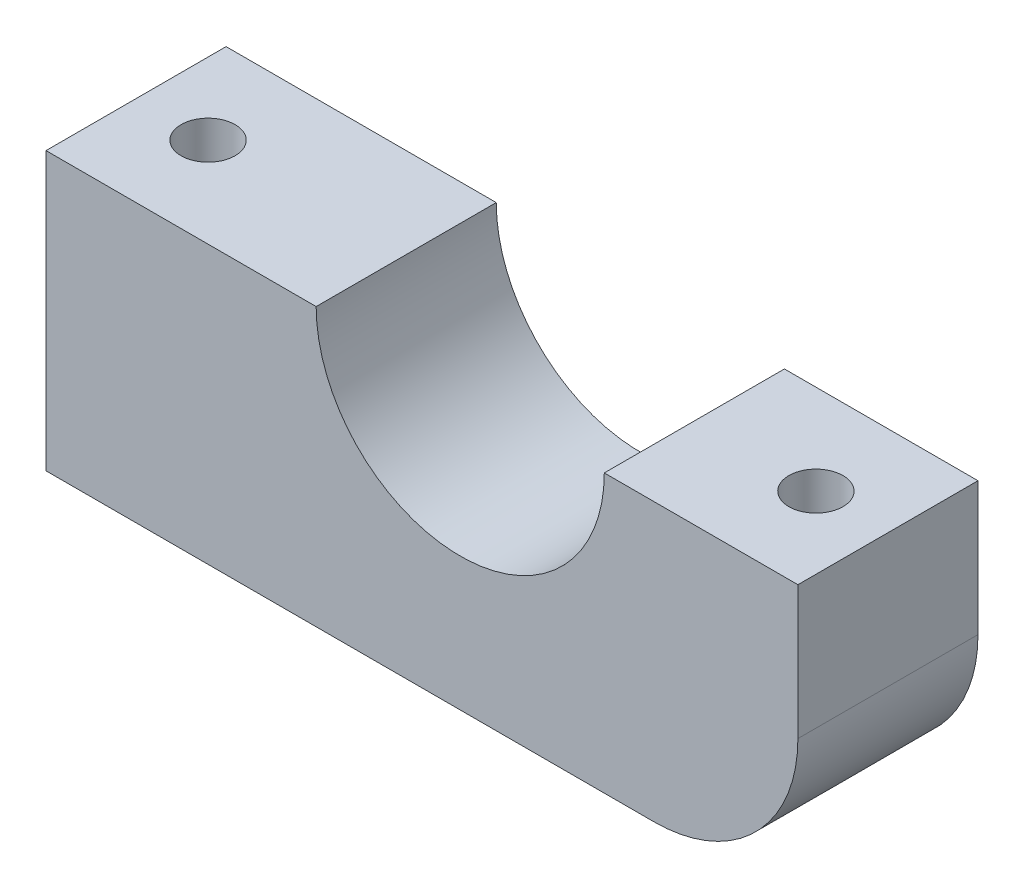
ISO-10303-21;
HEADER;
FILE_DESCRIPTION(('STEP AP214'),'2;1');
FILE_NAME('part.step','',(''),(''),'','','');
FILE_SCHEMA(('AUTOMOTIVE_DESIGN { 1 0 10303 214 1 1 1 1 }'));
ENDSEC;
DATA;
#1=APPLICATION_CONTEXT('core data for automotive mechanical design processes');
#2=APPLICATION_PROTOCOL_DEFINITION('international standard','automotive_design',2000,#1);
#3=PRODUCT_CONTEXT('',#1,'mechanical');
#4=PRODUCT('Part','Part','',(#3));
#5=PRODUCT_RELATED_PRODUCT_CATEGORY('part','',(#4));
#6=PRODUCT_DEFINITION_FORMATION('','',#4);
#7=PRODUCT_DEFINITION_CONTEXT('part definition',#1,'design');
#8=PRODUCT_DEFINITION('design','',#6,#7);
#9=PRODUCT_DEFINITION_SHAPE('','',#8);
#10=(LENGTH_UNIT() NAMED_UNIT(*) SI_UNIT(.MILLI.,.METRE.));
#11=(NAMED_UNIT(*) PLANE_ANGLE_UNIT() SI_UNIT($,.RADIAN.));
#12=(NAMED_UNIT(*) SI_UNIT($,.STERADIAN.) SOLID_ANGLE_UNIT());
#13=UNCERTAINTY_MEASURE_WITH_UNIT(LENGTH_MEASURE(1.E-05),#10,'distance_accuracy_value','');
#14=(GEOMETRIC_REPRESENTATION_CONTEXT(3) GLOBAL_UNCERTAINTY_ASSIGNED_CONTEXT((#13)) GLOBAL_UNIT_ASSIGNED_CONTEXT((#10,
#11,#12)) REPRESENTATION_CONTEXT('',''));
#15=CARTESIAN_POINT('',(0.,0.,0.));
#16=DIRECTION('',(0.,0.,1.));
#17=DIRECTION('',(1.,0.,0.));
#18=AXIS2_PLACEMENT_3D('',#15,#16,#17);
#19=CARTESIAN_POINT('',(0.,-7.40000000000001,10.));
#20=DIRECTION('',(-1.,0.,0.));
#21=DIRECTION('',(0.,0.,1.));
#22=AXIS2_PLACEMENT_3D('',#19,#20,#21);
#23=PLANE('',#22);
#24=DIRECTION('',(0.,1.,0.));
#25=VECTOR('',#24,1.);
#26=CARTESIAN_POINT('',(0.,-7.40000000000001,0.));
#27=LINE('',#26,#25);
#28=CARTESIAN_POINT('',(0.,-7.40000000000001,0.));
#29=VERTEX_POINT('',#28);
#30=CARTESIAN_POINT('',(0.,0.,0.));
#31=VERTEX_POINT('',#30);
#32=EDGE_CURVE('E129',#29,#31,#27,.T.);
#33=ORIENTED_EDGE('',*,*,#32,.T.);
#34=DIRECTION('',(0.,0.,-1.));
#35=VECTOR('',#34,1.);
#36=CARTESIAN_POINT('',(0.,0.,10.));
#37=LINE('',#36,#35);
#38=CARTESIAN_POINT('',(0.,0.,10.));
#39=VERTEX_POINT('',#38);
#40=EDGE_CURVE('E11',#39,#31,#37,.T.);
#41=ORIENTED_EDGE('',*,*,#40,.F.);
#42=DIRECTION('',(0.,1.,0.));
#43=VECTOR('',#42,1.);
#44=CARTESIAN_POINT('',(0.,-7.40000000000001,10.));
#45=LINE('',#44,#43);
#46=CARTESIAN_POINT('',(0.,-7.40000000000001,10.));
#47=VERTEX_POINT('',#46);
#48=EDGE_CURVE('E141',#47,#39,#45,.T.);
#49=ORIENTED_EDGE('',*,*,#48,.F.);
#50=DIRECTION('',(0.,0.,-1.));
#51=VECTOR('',#50,1.);
#52=CARTESIAN_POINT('',(0.,-7.40000000000001,10.));
#53=LINE('',#52,#51);
#54=EDGE_CURVE('E125',#47,#29,#53,.T.);
#55=ORIENTED_EDGE('',*,*,#54,.T.);
#56=EDGE_LOOP('',(#33,#41,#49,#55));
#57=FACE_BOUND('',#56,.T.);
#58=ADVANCED_FACE('F33',(#57),#23,.F.);
#59=CARTESIAN_POINT('',(0.,0.,10.));
#60=DIRECTION('',(0.,-1.,0.));
#61=DIRECTION('',(1.,0.,0.));
#62=AXIS2_PLACEMENT_3D('',#59,#60,#61);
#63=PLANE('',#62);
#64=CARTESIAN_POINT('',(-4.,0.,5.));
#65=DIRECTION('',(0.,-1.,0.));
#66=DIRECTION('',(0.,0.,-1.));
#67=AXIS2_PLACEMENT_3D('',#64,#65,#66);
#68=CIRCLE('',#67,1.5);
#69=CARTESIAN_POINT('',(-4.,0.,3.5));
#70=VERTEX_POINT('',#69);
#71=EDGE_CURVE('E165',#70,#70,#68,.T.);
#72=ORIENTED_EDGE('',*,*,#71,.T.);
#73=EDGE_LOOP('',(#72));
#74=FACE_BOUND('',#73,.T.);
#75=DIRECTION('',(-1.,0.,0.));
#76=VECTOR('',#75,1.);
#77=CARTESIAN_POINT('',(0.,0.,0.));
#78=LINE('',#77,#76);
#79=CARTESIAN_POINT('',(-10.75,0.,0.));
#80=VERTEX_POINT('',#79);
#81=EDGE_CURVE('E132',#31,#80,#78,.T.);
#82=ORIENTED_EDGE('',*,*,#81,.T.);
#83=DIRECTION('',(0.,0.,-1.));
#84=VECTOR('',#83,1.);
#85=CARTESIAN_POINT('',(-10.75,0.,10.));
#86=LINE('',#85,#84);
#87=CARTESIAN_POINT('',(-10.75,0.,10.));
#88=VERTEX_POINT('',#87);
#89=EDGE_CURVE('E47',#88,#80,#86,.T.);
#90=ORIENTED_EDGE('',*,*,#89,.F.);
#91=DIRECTION('',(-1.,0.,0.));
#92=VECTOR('',#91,1.);
#93=CARTESIAN_POINT('',(0.,0.,10.));
#94=LINE('',#93,#92);
#95=EDGE_CURVE('E95',#39,#88,#94,.T.);
#96=ORIENTED_EDGE('',*,*,#95,.F.);
#97=ORIENTED_EDGE('',*,*,#40,.T.);
#98=EDGE_LOOP('',(#82,#90,#96,#97));
#99=FACE_BOUND('',#98,.T.);
#100=ADVANCED_FACE('F195',(#74,#99),#63,.F.);
#101=CARTESIAN_POINT('',(-18.75,0.,10.));
#102=DIRECTION('',(0.,0.,-1.));
#103=DIRECTION('',(-1.,0.,0.));
#104=AXIS2_PLACEMENT_3D('',#101,#102,#103);
#105=CYLINDRICAL_SURFACE('',#104,8.);
#106=CARTESIAN_POINT('',(-18.75,0.,0.));
#107=DIRECTION('',(0.,0.,-1.));
#108=DIRECTION('',(-1.,0.,0.));
#109=AXIS2_PLACEMENT_3D('',#106,#107,#108);
#110=CIRCLE('',#109,8.);
#111=CARTESIAN_POINT('',(-26.75,0.,0.));
#112=VERTEX_POINT('',#111);
#113=EDGE_CURVE('E134',#80,#112,#110,.T.);
#114=ORIENTED_EDGE('',*,*,#113,.T.);
#115=DIRECTION('',(0.,0.,-1.));
#116=VECTOR('',#115,1.);
#117=CARTESIAN_POINT('',(-26.75,0.,10.));
#118=LINE('',#117,#116);
#119=CARTESIAN_POINT('',(-26.75,0.,10.));
#120=VERTEX_POINT('',#119);
#121=EDGE_CURVE('E145',#120,#112,#118,.T.);
#122=ORIENTED_EDGE('',*,*,#121,.F.);
#123=CARTESIAN_POINT('',(-18.75,0.,10.));
#124=DIRECTION('',(0.,0.,-1.));
#125=DIRECTION('',(-1.,0.,0.));
#126=AXIS2_PLACEMENT_3D('',#123,#124,#125);
#127=CIRCLE('',#126,8.);
#128=EDGE_CURVE('E154',#88,#120,#127,.T.);
#129=ORIENTED_EDGE('',*,*,#128,.F.);
#130=ORIENTED_EDGE('',*,*,#89,.T.);
#131=EDGE_LOOP('',(#114,#122,#129,#130));
#132=FACE_BOUND('',#131,.T.);
#133=ADVANCED_FACE('F152',(#132),#105,.F.);
#134=CARTESIAN_POINT('',(-26.75,0.,10.));
#135=DIRECTION('',(0.,-1.,0.));
#136=DIRECTION('',(1.,0.,0.));
#137=AXIS2_PLACEMENT_3D('',#134,#135,#136);
#138=PLANE('',#137);
#139=CARTESIAN_POINT('',(-37.75,0.,5.));
#140=DIRECTION('',(0.,-1.,0.));
#141=DIRECTION('',(0.,0.,-1.));
#142=AXIS2_PLACEMENT_3D('',#139,#140,#141);
#143=CIRCLE('',#142,1.5);
#144=CARTESIAN_POINT('',(-37.75,0.,3.5));
#145=VERTEX_POINT('',#144);
#146=EDGE_CURVE('E171',#145,#145,#143,.T.);
#147=ORIENTED_EDGE('',*,*,#146,.T.);
#148=EDGE_LOOP('',(#147));
#149=FACE_BOUND('',#148,.T.);
#150=DIRECTION('',(-1.,0.,0.));
#151=VECTOR('',#150,1.);
#152=CARTESIAN_POINT('',(-26.75,0.,0.));
#153=LINE('',#152,#151);
#154=CARTESIAN_POINT('',(-41.75,0.,0.));
#155=VERTEX_POINT('',#154);
#156=EDGE_CURVE('E136',#112,#155,#153,.T.);
#157=ORIENTED_EDGE('',*,*,#156,.T.);
#158=DIRECTION('',(0.,0.,-1.));
#159=VECTOR('',#158,1.);
#160=CARTESIAN_POINT('',(-41.75,0.,10.));
#161=LINE('',#160,#159);
#162=CARTESIAN_POINT('',(-41.75,0.,10.));
#163=VERTEX_POINT('',#162);
#164=EDGE_CURVE('E120',#163,#155,#161,.T.);
#165=ORIENTED_EDGE('',*,*,#164,.F.);
#166=DIRECTION('',(-1.,0.,0.));
#167=VECTOR('',#166,1.);
#168=CARTESIAN_POINT('',(-26.75,0.,10.));
#169=LINE('',#168,#167);
#170=EDGE_CURVE('E111',#120,#163,#169,.T.);
#171=ORIENTED_EDGE('',*,*,#170,.F.);
#172=ORIENTED_EDGE('',*,*,#121,.T.);
#173=EDGE_LOOP('',(#157,#165,#171,#172));
#174=FACE_BOUND('',#173,.T.);
#175=ADVANCED_FACE('F160',(#149,#174),#138,.F.);
#176=CARTESIAN_POINT('',(-41.75,0.,10.));
#177=DIRECTION('',(1.,0.,0.));
#178=DIRECTION('',(0.,0.,-1.));
#179=AXIS2_PLACEMENT_3D('',#176,#177,#178);
#180=PLANE('',#179);
#181=DIRECTION('',(0.,-1.,0.));
#182=VECTOR('',#181,1.);
#183=CARTESIAN_POINT('',(-41.75,0.,0.));
#184=LINE('',#183,#182);
#185=CARTESIAN_POINT('',(-41.75,-15.4,0.));
#186=VERTEX_POINT('',#185);
#187=EDGE_CURVE('E119',#155,#186,#184,.T.);
#188=ORIENTED_EDGE('',*,*,#187,.T.);
#189=DIRECTION('',(0.,0.,-1.));
#190=VECTOR('',#189,1.);
#191=CARTESIAN_POINT('',(-41.75,-15.4,10.));
#192=LINE('',#191,#190);
#193=CARTESIAN_POINT('',(-41.75,-15.4,10.));
#194=VERTEX_POINT('',#193);
#195=EDGE_CURVE('E116',#194,#186,#192,.T.);
#196=ORIENTED_EDGE('',*,*,#195,.F.);
#197=DIRECTION('',(0.,-1.,0.));
#198=VECTOR('',#197,1.);
#199=CARTESIAN_POINT('',(-41.75,0.,10.));
#200=LINE('',#199,#198);
#201=EDGE_CURVE('E105',#163,#194,#200,.T.);
#202=ORIENTED_EDGE('',*,*,#201,.F.);
#203=ORIENTED_EDGE('',*,*,#164,.T.);
#204=EDGE_LOOP('',(#188,#196,#202,#203));
#205=FACE_BOUND('',#204,.T.);
#206=ADVANCED_FACE('F117',(#205),#180,.F.);
#207=CARTESIAN_POINT('',(-41.75,-15.4,10.));
#208=DIRECTION('',(0.,1.,0.));
#209=DIRECTION('',(0.,0.,1.));
#210=AXIS2_PLACEMENT_3D('',#207,#208,#209);
#211=PLANE('',#210);
#212=CARTESIAN_POINT('',(-37.75,-15.4,5.));
#213=DIRECTION('',(0.,-1.,0.));
#214=DIRECTION('',(0.,0.,-1.));
#215=AXIS2_PLACEMENT_3D('',#212,#213,#214);
#216=CIRCLE('',#215,1.5);
#217=CARTESIAN_POINT('',(-37.75,-15.4,3.5));
#218=VERTEX_POINT('',#217);
#219=EDGE_CURVE('E168',#218,#218,#216,.T.);
#220=ORIENTED_EDGE('',*,*,#219,.F.);
#221=EDGE_LOOP('',(#220));
#222=FACE_BOUND('',#221,.T.);
#223=DIRECTION('',(1.,0.,0.));
#224=VECTOR('',#223,1.);
#225=CARTESIAN_POINT('',(-41.75,-15.4,0.));
#226=LINE('',#225,#224);
#227=CARTESIAN_POINT('',(-7.99999999999999,-15.4,0.));
#228=VERTEX_POINT('',#227);
#229=EDGE_CURVE('E81',#186,#228,#226,.T.);
#230=ORIENTED_EDGE('',*,*,#229,.T.);
#231=DIRECTION('',(0.,0.,-1.));
#232=VECTOR('',#231,1.);
#233=CARTESIAN_POINT('',(-7.99999999999999,-15.4,10.));
#234=LINE('',#233,#232);
#235=CARTESIAN_POINT('',(-7.99999999999999,-15.4,10.));
#236=VERTEX_POINT('',#235);
#237=EDGE_CURVE('E121',#236,#228,#234,.T.);
#238=ORIENTED_EDGE('',*,*,#237,.F.);
#239=DIRECTION('',(1.,0.,0.));
#240=VECTOR('',#239,1.);
#241=CARTESIAN_POINT('',(-41.75,-15.4,10.));
#242=LINE('',#241,#240);
#243=EDGE_CURVE('E109',#194,#236,#242,.T.);
#244=ORIENTED_EDGE('',*,*,#243,.F.);
#245=ORIENTED_EDGE('',*,*,#195,.T.);
#246=EDGE_LOOP('',(#230,#238,#244,#245));
#247=FACE_BOUND('',#246,.T.);
#248=ADVANCED_FACE('F123',(#222,#247),#211,.F.);
#249=CARTESIAN_POINT('',(-7.99999999999999,-7.40000000000001,10.));
#250=DIRECTION('',(0.,0.,-1.));
#251=DIRECTION('',(-1.,0.,0.));
#252=AXIS2_PLACEMENT_3D('',#249,#250,#251);
#253=CYLINDRICAL_SURFACE('',#252,7.99999999999999);
#254=CARTESIAN_POINT('',(-4.,-14.3282032302755,3.5));
#255=CARTESIAN_POINT('',(-4.08680670402507,-14.3783233106405,3.49999989272947));
#256=CARTESIAN_POINT('',(-4.17455896428764,-14.4267933749712,3.50753757262054));
#257=CARTESIAN_POINT('',(-4.34960501359529,-14.5192971023157,3.53860865036146));
#258=CARTESIAN_POINT('',(-4.43689899932406,-14.563332846585,3.56213450357897));
#259=CARTESIAN_POINT('',(-4.60852404850147,-14.6461730341864,3.62591050608382));
#260=CARTESIAN_POINT('',(-4.69283593978991,-14.6849470305588,3.66625291410436));
#261=CARTESIAN_POINT('',(-4.85434507326227,-14.7561296767181,3.76348816226957));
#262=CARTESIAN_POINT('',(-4.93154569067832,-14.7885413546081,3.82037309696233));
#263=CARTESIAN_POINT('',(-5.06777038535734,-14.8435807905122,3.94292678121187));
#264=CARTESIAN_POINT('',(-5.12784138072442,-14.8668643697944,4.00713880268065));
#265=CARTESIAN_POINT('',(-5.23646678252848,-14.9077467282545,4.14622996176544));
#266=CARTESIAN_POINT('',(-5.28502676327006,-14.9253482605113,4.22110390802047));
#267=CARTESIAN_POINT('',(-5.36518085166446,-14.953767480843,4.37303483019136));
#268=CARTESIAN_POINT('',(-5.3977951778787,-14.9650039204844,4.4494772384912));
#269=CARTESIAN_POINT('',(-5.45003379735012,-14.9827726075745,4.60719348170719));
#270=CARTESIAN_POINT('',(-5.46966101263259,-14.9893059132305,4.68846622533782));
#271=CARTESIAN_POINT('',(-5.49473118069431,-14.997617875685,4.85068013457382));
#272=CARTESIAN_POINT('',(-5.50061518571535,-14.9995444244252,4.93154592688109));
#273=CARTESIAN_POINT('',(-5.49928312154889,-14.9991062747023,5.0931552140267));
#274=CARTESIAN_POINT('',(-5.49206810402221,-14.9967419207363,5.17389871816211));
#275=CARTESIAN_POINT('',(-5.46491933608708,-14.9877246289447,5.33228869197247));
#276=CARTESIAN_POINT('',(-5.4450893041174,-14.9811066590564,5.40995498114689));
#277=CARTESIAN_POINT('',(-5.39353922571779,-14.9635374291953,5.56070874518144));
#278=CARTESIAN_POINT('',(-5.36181943753214,-14.9525862633387,5.63379631945055));
#279=CARTESIAN_POINT('',(-5.28738157568995,-14.9261719804428,5.77394453884486));
#280=CARTESIAN_POINT('',(-5.24458465452082,-14.9106764063163,5.84095712390285));
#281=CARTESIAN_POINT('',(-5.14968128626279,-14.8751751099636,5.96666302567109));
#282=CARTESIAN_POINT('',(-5.09757425165783,-14.8551691030851,6.0253558169401));
#283=CARTESIAN_POINT('',(-4.984316172656,-14.8100917892311,6.13467590398808));
#284=CARTESIAN_POINT('',(-4.92295144777113,-14.7848935007073,6.18502893442128));
#285=CARTESIAN_POINT('',(-4.79447106226799,-14.7300383743339,6.27473933207851));
#286=CARTESIAN_POINT('',(-4.72735417657801,-14.7003805856984,6.31409434934844));
#287=CARTESIAN_POINT('',(-4.58515650482647,-14.6350075387128,6.38355993965957));
#288=CARTESIAN_POINT('',(-4.50984016060917,-14.5990294827053,6.41293866355232));
#289=CARTESIAN_POINT('',(-4.35736816786328,-14.523096161896,6.45898573008983));
#290=CARTESIAN_POINT('',(-4.28021177030279,-14.4831392556548,6.47564880224134));
#291=CARTESIAN_POINT('',(-4.11797621332024,-14.3956580876246,6.49781913335193));
#292=CARTESIAN_POINT('',(-4.03290667113345,-14.3477789092468,6.50198765147735));
#293=CARTESIAN_POINT('',(-3.86495791225382,-14.2491555946787,6.49627323860909));
#294=CARTESIAN_POINT('',(-3.7820794991175,-14.1984104282628,6.48638522349753));
#295=CARTESIAN_POINT('',(-3.60991356089666,-14.0887078183162,6.45137509107178));
#296=CARTESIAN_POINT('',(-3.52112901002705,-14.0295196003175,6.42449509586432));
#297=CARTESIAN_POINT('',(-3.35007660654954,-13.9106901838141,6.35504142529164));
#298=CARTESIAN_POINT('',(-3.26781835787889,-13.851048454259,6.31244512424913));
#299=CARTESIAN_POINT('',(-3.10520918157032,-13.7286801445301,6.2080747225438));
#300=CARTESIAN_POINT('',(-3.02556520504035,-13.6661005276662,6.14501648483447));
#301=CARTESIAN_POINT('',(-2.8786425938171,-13.5465937813204,6.00152845609086));
#302=CARTESIAN_POINT('',(-2.81133733175009,-13.4896546046943,5.92113690730113));
#303=CARTESIAN_POINT('',(-2.71403853973603,-13.4050964720593,5.77524208358828));
#304=CARTESIAN_POINT('',(-2.67931735166543,-13.3742824588362,5.71472711097872));
#305=CARTESIAN_POINT('',(-2.61786597555449,-13.3189809824994,5.58711085645145));
#306=CARTESIAN_POINT('',(-2.59112232931899,-13.2944828739772,5.52002092357982));
#307=CARTESIAN_POINT('',(-2.55053671491501,-13.256961707142,5.39102889731088));
#308=CARTESIAN_POINT('',(-2.53534833467103,-13.2427577097022,5.32989870217814));
#309=CARTESIAN_POINT('',(-2.51272321000711,-13.2215152272371,5.20500166814518));
#310=CARTESIAN_POINT('',(-2.50528161719868,-13.2144722604883,5.14123650437675));
#311=CARTESIAN_POINT('',(-2.49867079437491,-13.2082183681492,5.0127078745318));
#312=CARTESIAN_POINT('',(-2.49952437293753,-13.209029037062,4.94794214509067));
#313=CARTESIAN_POINT('',(-2.50949295835815,-13.2184513423829,4.81963006565738));
#314=CARTESIAN_POINT('',(-2.51861020052893,-13.2270650895155,4.75608405034634));
#315=CARTESIAN_POINT('',(-2.5439820084511,-13.2508247817027,4.63429266913699));
#316=CARTESIAN_POINT('',(-2.5599599197862,-13.2657171588353,4.57593816667355));
#317=CARTESIAN_POINT('',(-2.59813348742472,-13.3008907394917,4.46303793972127));
#318=CARTESIAN_POINT('',(-2.6203322791913,-13.3211746602083,4.40849415328319));
#319=CARTESIAN_POINT('',(-2.68130646263219,-13.3761058166637,4.28019862087498));
#320=CARTESIAN_POINT('',(-2.72304491344685,-13.4131077289399,4.20885854201116));
#321=CARTESIAN_POINT('',(-2.81557044596737,-13.4930655503227,4.07603628362434));
#322=CARTESIAN_POINT('',(-2.8663772702907,-13.536034403724,4.01457617996077));
#323=CARTESIAN_POINT('',(-2.98947782411676,-13.6371884761729,3.88707861459378));
#324=CARTESIAN_POINT('',(-3.06393062322192,-13.696435456441,3.82396633842609));
#325=CARTESIAN_POINT('',(-3.22216087582968,-13.8173358833803,3.71381562438441));
#326=CARTESIAN_POINT('',(-3.30594564444854,-13.8789911929544,3.66678991563277));
#327=CARTESIAN_POINT('',(-3.48767800043232,-14.006982185154,3.58644670574708));
#328=CARTESIAN_POINT('',(-3.58621892705186,-14.0733143313479,3.55445643722913));
#329=CARTESIAN_POINT('',(-3.7893739499207,-14.2033173639735,3.51124368086383));
#330=CARTESIAN_POINT('',(-3.89398177563668,-14.2669908851586,3.50000013101098));
#331=CARTESIAN_POINT('',(-4.,-14.3282032302755,3.5));
#332=B_SPLINE_CURVE_WITH_KNOTS('',3,(#254,#255,#256,#257,#258,#259,#260,#261,#262,#263,#264,
#265,#266,#267,#268,#269,#270,#271,#272,#273,#274,#275,#276,#277,#278,#279,#280,#281,#282,#283,
#284,#285,#286,#287,#288,#289,#290,#291,#292,#293,#294,#295,#296,#297,#298,#299,#300,#301,#302,
#303,#304,#305,#306,#307,#308,#309,#310,#311,#312,#313,#314,#315,#316,#317,#318,#319,#320,#321,
#322,#323,#324,#325,#326,#327,#328,#329,#330,#331),.UNSPECIFIED.,.T.,.F.,(4,2,2,2,2,2,2,2,2,2,2,
2,2,2,2,2,2,2,2,2,2,2,2,2,2,2,2,2,2,2,2,2,2,2,2,2,2,2,4),(0.,0.300354280088123,
0.600566924822285,0.90244873209113,1.20418651049774,1.47560855829427,1.74689889795982,
1.99724955213162,2.24754385967489,2.48968818665662,2.73181307383365,2.97197253676764,
3.21212678376495,3.45403986461503,3.69596821682061,3.94472200054765,4.1935288951224,
4.45789220766784,4.72236503637624,5.01431243948566,5.30636546413706,5.63511092350627,
5.96433151344137,6.32049354255421,6.67587767356415,6.90390942860214,7.13155428736173,
7.32444185392624,7.51720862756407,7.71050558642404,7.90385484752825,8.09004791047869,
8.27633498821738,8.54651437774297,8.81728930921798,9.15807479278623,9.49912931571592,
9.86632912439832,10.2331559474242),.UNSPECIFIED.);
#333=CARTESIAN_POINT('',(-4.,-14.3282032302755,3.5));
#334=VERTEX_POINT('',#333);
#335=EDGE_CURVE('E36',#334,#334,#332,.T.);
#336=ORIENTED_EDGE('',*,*,#335,.T.);
#337=EDGE_LOOP('',(#336));
#338=FACE_BOUND('',#337,.T.);
#339=CARTESIAN_POINT('',(-7.99999999999999,-7.40000000000001,0.));
#340=DIRECTION('',(0.,0.,1.));
#341=DIRECTION('',(1.,0.,0.));
#342=AXIS2_PLACEMENT_3D('',#339,#340,#341);
#343=CIRCLE('',#342,7.99999999999999);
#344=EDGE_CURVE('E87',#228,#29,#343,.T.);
#345=ORIENTED_EDGE('',*,*,#344,.T.);
#346=ORIENTED_EDGE('',*,*,#54,.F.);
#347=CARTESIAN_POINT('',(-7.99999999999999,-7.40000000000001,10.));
#348=DIRECTION('',(0.,0.,1.));
#349=DIRECTION('',(1.,0.,0.));
#350=AXIS2_PLACEMENT_3D('',#347,#348,#349);
#351=CIRCLE('',#350,7.99999999999999);
#352=EDGE_CURVE('E55',#236,#47,#351,.T.);
#353=ORIENTED_EDGE('',*,*,#352,.F.);
#354=ORIENTED_EDGE('',*,*,#237,.T.);
#355=EDGE_LOOP('',(#345,#346,#353,#354));
#356=FACE_BOUND('',#355,.T.);
#357=ADVANCED_FACE('F178',(#338,#356),#253,.T.);
#358=CARTESIAN_POINT('',(-18.75,0.,10.));
#359=DIRECTION('',(0.,0.,-1.));
#360=DIRECTION('',(-1.,0.,0.));
#361=AXIS2_PLACEMENT_3D('',#358,#359,#360);
#362=PLANE('',#361);
#363=ORIENTED_EDGE('',*,*,#48,.T.);
#364=ORIENTED_EDGE('',*,*,#95,.T.);
#365=ORIENTED_EDGE('',*,*,#128,.T.);
#366=ORIENTED_EDGE('',*,*,#170,.T.);
#367=ORIENTED_EDGE('',*,*,#201,.T.);
#368=ORIENTED_EDGE('',*,*,#243,.T.);
#369=ORIENTED_EDGE('',*,*,#352,.T.);
#370=EDGE_LOOP('',(#363,#364,#365,#366,#367,#368,#369));
#371=FACE_BOUND('',#370,.T.);
#372=ADVANCED_FACE('F107',(#371),#362,.F.);
#373=CARTESIAN_POINT('',(-18.75,0.,0.));
#374=DIRECTION('',(0.,0.,-1.));
#375=DIRECTION('',(-1.,0.,0.));
#376=AXIS2_PLACEMENT_3D('',#373,#374,#375);
#377=PLANE('',#376);
#378=ORIENTED_EDGE('',*,*,#32,.F.);
#379=ORIENTED_EDGE('',*,*,#344,.F.);
#380=ORIENTED_EDGE('',*,*,#229,.F.);
#381=ORIENTED_EDGE('',*,*,#187,.F.);
#382=ORIENTED_EDGE('',*,*,#156,.F.);
#383=ORIENTED_EDGE('',*,*,#113,.F.);
#384=ORIENTED_EDGE('',*,*,#81,.F.);
#385=EDGE_LOOP('',(#378,#379,#380,#381,#382,#383,#384));
#386=FACE_BOUND('',#385,.T.);
#387=ADVANCED_FACE('F158',(#386),#377,.T.);
#388=CARTESIAN_POINT('',(-4.,0.,5.));
#389=DIRECTION('',(0.,-1.,0.));
#390=DIRECTION('',(0.,0.,-1.));
#391=AXIS2_PLACEMENT_3D('',#388,#389,#390);
#392=CYLINDRICAL_SURFACE('',#391,1.5);
#393=ORIENTED_EDGE('',*,*,#71,.F.);
#394=EDGE_LOOP('',(#393));
#395=FACE_BOUND('',#394,.T.);
#396=ORIENTED_EDGE('',*,*,#335,.F.);
#397=EDGE_LOOP('',(#396));
#398=FACE_BOUND('',#397,.T.);
#399=ADVANCED_FACE('F180',(#395,#398),#392,.F.);
#400=CARTESIAN_POINT('',(-37.75,0.,5.));
#401=DIRECTION('',(0.,-1.,0.));
#402=DIRECTION('',(0.,0.,-1.));
#403=AXIS2_PLACEMENT_3D('',#400,#401,#402);
#404=CYLINDRICAL_SURFACE('',#403,1.5);
#405=CARTESIAN_POINT('',(-37.75,0.,3.5));
#406=CARTESIAN_POINT('',(-37.75,-0.160416666666667,3.5));
#407=CARTESIAN_POINT('',(-37.75,-0.320833333333333,3.5));
#408=CARTESIAN_POINT('',(-37.75,-0.641666666666667,3.5));
#409=CARTESIAN_POINT('',(-37.75,-0.802083333333333,3.5));
#410=CARTESIAN_POINT('',(-37.75,-1.12291666666667,3.5));
#411=CARTESIAN_POINT('',(-37.75,-1.28333333333333,3.5));
#412=CARTESIAN_POINT('',(-37.75,-1.60416666666667,3.5));
#413=CARTESIAN_POINT('',(-37.75,-1.76458333333333,3.5));
#414=CARTESIAN_POINT('',(-37.75,-2.08541666666667,3.5));
#415=CARTESIAN_POINT('',(-37.75,-2.24583333333333,3.5));
#416=CARTESIAN_POINT('',(-37.75,-2.56666666666667,3.5));
#417=CARTESIAN_POINT('',(-37.75,-2.72708333333333,3.5));
#418=CARTESIAN_POINT('',(-37.75,-3.04791666666667,3.5));
#419=CARTESIAN_POINT('',(-37.75,-3.20833333333333,3.5));
#420=CARTESIAN_POINT('',(-37.75,-3.52916666666667,3.5));
#421=CARTESIAN_POINT('',(-37.75,-3.68958333333333,3.5));
#422=CARTESIAN_POINT('',(-37.75,-4.01041666666667,3.5));
#423=CARTESIAN_POINT('',(-37.75,-4.17083333333333,3.5));
#424=CARTESIAN_POINT('',(-37.75,-4.49166666666667,3.5));
#425=CARTESIAN_POINT('',(-37.75,-4.65208333333333,3.5));
#426=CARTESIAN_POINT('',(-37.75,-4.97291666666667,3.5));
#427=CARTESIAN_POINT('',(-37.75,-5.13333333333333,3.5));
#428=CARTESIAN_POINT('',(-37.75,-5.45416666666667,3.5));
#429=CARTESIAN_POINT('',(-37.75,-5.61458333333333,3.5));
#430=CARTESIAN_POINT('',(-37.75,-5.93541666666667,3.5));
#431=CARTESIAN_POINT('',(-37.75,-6.09583333333333,3.5));
#432=CARTESIAN_POINT('',(-37.75,-6.41666666666667,3.5));
#433=CARTESIAN_POINT('',(-37.75,-6.57708333333333,3.5));
#434=CARTESIAN_POINT('',(-37.75,-6.89791666666667,3.5));
#435=CARTESIAN_POINT('',(-37.75,-7.05833333333333,3.5));
#436=CARTESIAN_POINT('',(-37.75,-7.37916666666667,3.5));
#437=CARTESIAN_POINT('',(-37.75,-7.53958333333333,3.5));
#438=CARTESIAN_POINT('',(-37.75,-7.86041666666667,3.5));
#439=CARTESIAN_POINT('',(-37.75,-8.02083333333333,3.5));
#440=CARTESIAN_POINT('',(-37.75,-8.34166666666667,3.5));
#441=CARTESIAN_POINT('',(-37.75,-8.50208333333333,3.5));
#442=CARTESIAN_POINT('',(-37.75,-8.82291666666666,3.5));
#443=CARTESIAN_POINT('',(-37.75,-8.98333333333333,3.5));
#444=CARTESIAN_POINT('',(-37.75,-9.30416666666667,3.5));
#445=CARTESIAN_POINT('',(-37.75,-9.46458333333333,3.5));
#446=CARTESIAN_POINT('',(-37.75,-9.78541666666666,3.5));
#447=CARTESIAN_POINT('',(-37.75,-9.94583333333333,3.5));
#448=CARTESIAN_POINT('',(-37.75,-10.2666666666667,3.5));
#449=CARTESIAN_POINT('',(-37.75,-10.4270833333333,3.5));
#450=CARTESIAN_POINT('',(-37.75,-10.7479166666667,3.5));
#451=CARTESIAN_POINT('',(-37.75,-10.9083333333333,3.5));
#452=CARTESIAN_POINT('',(-37.75,-11.2291666666667,3.5));
#453=CARTESIAN_POINT('',(-37.75,-11.3895833333333,3.5));
#454=CARTESIAN_POINT('',(-37.75,-11.7104166666667,3.5));
#455=CARTESIAN_POINT('',(-37.75,-11.8708333333333,3.5));
#456=CARTESIAN_POINT('',(-37.75,-12.1916666666667,3.5));
#457=CARTESIAN_POINT('',(-37.75,-12.3520833333333,3.5));
#458=CARTESIAN_POINT('',(-37.75,-12.6729166666667,3.5));
#459=CARTESIAN_POINT('',(-37.75,-12.8333333333333,3.5));
#460=CARTESIAN_POINT('',(-37.75,-13.1541666666667,3.5));
#461=CARTESIAN_POINT('',(-37.75,-13.3145833333333,3.5));
#462=CARTESIAN_POINT('',(-37.75,-13.6354166666667,3.5));
#463=CARTESIAN_POINT('',(-37.75,-13.7958333333333,3.5));
#464=CARTESIAN_POINT('',(-37.75,-14.1166666666667,3.5));
#465=CARTESIAN_POINT('',(-37.75,-14.2770833333333,3.5));
#466=CARTESIAN_POINT('',(-37.75,-14.5979166666667,3.5));
#467=CARTESIAN_POINT('',(-37.75,-14.7583333333333,3.5));
#468=CARTESIAN_POINT('',(-37.75,-15.0791666666667,3.5));
#469=CARTESIAN_POINT('',(-37.75,-15.2395833333333,3.5));
#470=CARTESIAN_POINT('',(-37.75,-15.4,3.5));
#471=B_SPLINE_CURVE_WITH_KNOTS('',3,(#405,#406,#407,#408,#409,#410,#411,#412,#413,#414,#415,
#416,#417,#418,#419,#420,#421,#422,#423,#424,#425,#426,#427,#428,#429,#430,#431,#432,#433,#434,
#435,#436,#437,#438,#439,#440,#441,#442,#443,#444,#445,#446,#447,#448,#449,#450,#451,#452,#453,
#454,#455,#456,#457,#458,#459,#460,#461,#462,#463,#464,#465,#466,#467,#468,#469,#470),
.UNSPECIFIED.,.F.,.F.,(4,2,2,2,2,2,2,2,2,2,2,2,2,2,2,2,2,2,2,2,2,2,2,2,2,2,2,2,2,2,2,2,4),(0.,
0.48125,0.9625,1.44375,1.925,2.40625,2.8875,3.36875,3.85,4.33125,4.8125,5.29375,5.775,6.25625,
6.7375,7.21875,7.7,8.18125,8.6625,9.14375,9.625,10.10625,10.5875,11.06875,11.55,12.03125,
12.5125,12.99375,13.475,13.95625,14.4375,14.91875,15.4),.UNSPECIFIED.);
#472=EDGE_CURVE('BSEAM182',#145,#218,#471,.T.);
#473=ORIENTED_EDGE('',*,*,#146,.F.);
#474=ORIENTED_EDGE('',*,*,#219,.T.);
#475=ORIENTED_EDGE('',*,*,#472,.T.);
#476=ORIENTED_EDGE('',*,*,#472,.F.);
#477=EDGE_LOOP('',(#473,#475,#474,#476));
#478=FACE_BOUND('',#477,.T.);
#479=ADVANCED_FACE('F182',(#478),#404,.F.);
#480=CLOSED_SHELL('',(#58,#100,#133,#175,#206,#248,#357,#372,#387,#399,#479));
#481=MANIFOLD_SOLID_BREP('B2',#480);
#482=ADVANCED_BREP_SHAPE_REPRESENTATION('',(#18,#481),#14);
#483=SHAPE_DEFINITION_REPRESENTATION(#9,#482);
ENDSEC;
END-ISO-10303-21;
